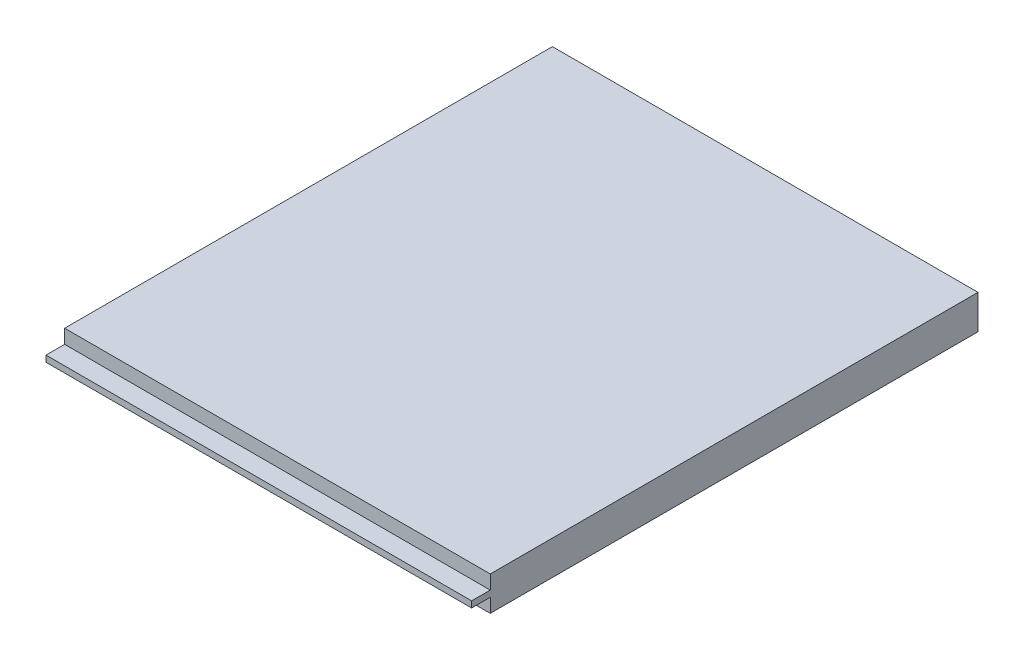
ISO-10303-21;
HEADER;
FILE_DESCRIPTION(('STEP AP214'),'2;1');
FILE_NAME('part.step','',(''),(''),'','','');
FILE_SCHEMA(('AUTOMOTIVE_DESIGN { 1 0 10303 214 1 1 1 1 }'));
ENDSEC;
DATA;
#1=APPLICATION_CONTEXT('core data for automotive mechanical design processes');
#2=APPLICATION_PROTOCOL_DEFINITION('international standard','automotive_design',2000,#1);
#3=PRODUCT_CONTEXT('',#1,'mechanical');
#4=PRODUCT('Part','Part','',(#3));
#5=PRODUCT_RELATED_PRODUCT_CATEGORY('part','',(#4));
#6=PRODUCT_DEFINITION_FORMATION('','',#4);
#7=PRODUCT_DEFINITION_CONTEXT('part definition',#1,'design');
#8=PRODUCT_DEFINITION('design','',#6,#7);
#9=PRODUCT_DEFINITION_SHAPE('','',#8);
#10=(LENGTH_UNIT() NAMED_UNIT(*) SI_UNIT(.MILLI.,.METRE.));
#11=(NAMED_UNIT(*) PLANE_ANGLE_UNIT() SI_UNIT($,.RADIAN.));
#12=(NAMED_UNIT(*) SI_UNIT($,.STERADIAN.) SOLID_ANGLE_UNIT());
#13=UNCERTAINTY_MEASURE_WITH_UNIT(LENGTH_MEASURE(1.E-05),#10,'distance_accuracy_value','');
#14=(GEOMETRIC_REPRESENTATION_CONTEXT(3) GLOBAL_UNCERTAINTY_ASSIGNED_CONTEXT((#13)) GLOBAL_UNIT_ASSIGNED_CONTEXT((#10,
#11,#12)) REPRESENTATION_CONTEXT('',''));
#15=CARTESIAN_POINT('',(0.,0.,0.));
#16=DIRECTION('',(0.,0.,1.));
#17=DIRECTION('',(1.,0.,0.));
#18=AXIS2_PLACEMENT_3D('',#15,#16,#17);
#19=CARTESIAN_POINT('',(-34.25,2.74999999999997,40.75));
#20=DIRECTION('',(1.,0.,0.));
#21=DIRECTION('',(0.,0.,-1.));
#22=AXIS2_PLACEMENT_3D('',#19,#20,#21);
#23=PLANE('',#22);
#24=DIRECTION('',(0.,-1.,0.));
#25=VECTOR('',#24,1.);
#26=CARTESIAN_POINT('',(-34.25,-0.5,37.75));
#27=LINE('',#26,#25);
#28=CARTESIAN_POINT('',(-34.25,-0.5,37.75));
#29=VERTEX_POINT('',#28);
#30=CARTESIAN_POINT('',(-34.25,-2.75000000000002,37.75));
#31=VERTEX_POINT('',#30);
#32=EDGE_CURVE('E101',#29,#31,#27,.T.);
#33=ORIENTED_EDGE('',*,*,#32,.F.);
#34=DIRECTION('',(0.,0.,1.));
#35=VECTOR('',#34,1.);
#36=CARTESIAN_POINT('',(-34.25,-0.5,37.75));
#37=LINE('',#36,#35);
#38=CARTESIAN_POINT('',(-34.25,-0.5,40.75));
#39=VERTEX_POINT('',#38);
#40=EDGE_CURVE('E98',#29,#39,#37,.T.);
#41=ORIENTED_EDGE('',*,*,#40,.T.);
#42=DIRECTION('',(0.,-1.,0.));
#43=VECTOR('',#42,1.);
#44=CARTESIAN_POINT('',(-34.25,2.74999999999997,40.75));
#45=LINE('',#44,#43);
#46=CARTESIAN_POINT('',(-34.25,0.5,40.75));
#47=VERTEX_POINT('',#46);
#48=EDGE_CURVE('E138',#47,#39,#45,.T.);
#49=ORIENTED_EDGE('',*,*,#48,.F.);
#50=DIRECTION('',(0.,0.,1.));
#51=VECTOR('',#50,1.);
#52=CARTESIAN_POINT('',(-34.25,0.5,37.75));
#53=LINE('',#52,#51);
#54=CARTESIAN_POINT('',(-34.25,0.5,37.75));
#55=VERTEX_POINT('',#54);
#56=EDGE_CURVE('E55',#55,#47,#53,.T.);
#57=ORIENTED_EDGE('',*,*,#56,.F.);
#58=DIRECTION('',(0.,-1.,0.));
#59=VECTOR('',#58,1.);
#60=CARTESIAN_POINT('',(-34.25,2.74999999999997,37.75));
#61=LINE('',#60,#59);
#62=CARTESIAN_POINT('',(-34.25,2.74999999999997,37.75));
#63=VERTEX_POINT('',#62);
#64=EDGE_CURVE('E131',#63,#55,#61,.T.);
#65=ORIENTED_EDGE('',*,*,#64,.F.);
#66=DIRECTION('',(0.,0.,-1.));
#67=VECTOR('',#66,1.);
#68=CARTESIAN_POINT('',(-34.25,2.74999999999997,40.75));
#69=LINE('',#68,#67);
#70=CARTESIAN_POINT('',(-34.25,2.74999999999997,-40.75));
#71=VERTEX_POINT('',#70);
#72=EDGE_CURVE('E143',#63,#71,#69,.T.);
#73=ORIENTED_EDGE('',*,*,#72,.T.);
#74=DIRECTION('',(0.,-1.,0.));
#75=VECTOR('',#74,1.);
#76=CARTESIAN_POINT('',(-34.25,2.74999999999997,-40.75));
#77=LINE('',#76,#75);
#78=CARTESIAN_POINT('',(-34.25,-2.75000000000002,-40.75));
#79=VERTEX_POINT('',#78);
#80=EDGE_CURVE('E118',#71,#79,#77,.T.);
#81=ORIENTED_EDGE('',*,*,#80,.T.);
#82=DIRECTION('',(0.,0.,-1.));
#83=VECTOR('',#82,1.);
#84=CARTESIAN_POINT('',(-34.25,-2.75000000000002,40.75));
#85=LINE('',#84,#83);
#86=EDGE_CURVE('E11',#31,#79,#85,.T.);
#87=ORIENTED_EDGE('',*,*,#86,.F.);
#88=EDGE_LOOP('',(#33,#41,#49,#57,#65,#73,#81,#87));
#89=FACE_BOUND('',#88,.T.);
#90=ADVANCED_FACE('F33',(#89),#23,.F.);
#91=CARTESIAN_POINT('',(-34.25,-2.75000000000002,40.75));
#92=DIRECTION('',(0.,1.,0.));
#93=DIRECTION('',(-1.,0.,0.));
#94=AXIS2_PLACEMENT_3D('',#91,#92,#93);
#95=PLANE('',#94);
#96=DIRECTION('',(0.,0.,-1.));
#97=VECTOR('',#96,1.);
#98=CARTESIAN_POINT('',(34.25,-2.75,40.75));
#99=LINE('',#98,#97);
#100=CARTESIAN_POINT('',(34.25,-2.75000000000002,37.75));
#101=VERTEX_POINT('',#100);
#102=CARTESIAN_POINT('',(34.25,-2.75,-40.75));
#103=VERTEX_POINT('',#102);
#104=EDGE_CURVE('E40',#101,#103,#99,.T.);
#105=ORIENTED_EDGE('',*,*,#104,.F.);
#106=DIRECTION('',(1.,0.,0.));
#107=VECTOR('',#106,1.);
#108=CARTESIAN_POINT('',(34.25,-2.75000000000002,37.75));
#109=LINE('',#108,#107);
#110=EDGE_CURVE('E107',#31,#101,#109,.T.);
#111=ORIENTED_EDGE('',*,*,#110,.F.);
#112=ORIENTED_EDGE('',*,*,#86,.T.);
#113=DIRECTION('',(1.,0.,0.));
#114=VECTOR('',#113,1.);
#115=CARTESIAN_POINT('',(-34.25,-2.75000000000002,-40.75));
#116=LINE('',#115,#114);
#117=EDGE_CURVE('E146',#79,#103,#116,.T.);
#118=ORIENTED_EDGE('',*,*,#117,.T.);
#119=EDGE_LOOP('',(#105,#111,#112,#118));
#120=FACE_BOUND('',#119,.T.);
#121=ADVANCED_FACE('F161',(#120),#95,.F.);
#122=CARTESIAN_POINT('',(34.25,2.74999999999999,40.75));
#123=DIRECTION('',(-1.,0.,0.));
#124=DIRECTION('',(0.,0.,1.));
#125=AXIS2_PLACEMENT_3D('',#122,#123,#124);
#126=PLANE('',#125);
#127=DIRECTION('',(0.,1.,0.));
#128=VECTOR('',#127,1.);
#129=CARTESIAN_POINT('',(34.25,2.74999999999999,40.75));
#130=LINE('',#129,#128);
#131=CARTESIAN_POINT('',(34.25,-0.5,40.75));
#132=VERTEX_POINT('',#131);
#133=CARTESIAN_POINT('',(34.25,0.5,40.75));
#134=VERTEX_POINT('',#133);
#135=EDGE_CURVE('E116',#132,#134,#130,.T.);
#136=ORIENTED_EDGE('',*,*,#135,.F.);
#137=DIRECTION('',(0.,0.,1.));
#138=VECTOR('',#137,1.);
#139=CARTESIAN_POINT('',(34.25,-0.5,37.75));
#140=LINE('',#139,#138);
#141=CARTESIAN_POINT('',(34.25,-0.5,37.75));
#142=VERTEX_POINT('',#141);
#143=EDGE_CURVE('E47',#142,#132,#140,.T.);
#144=ORIENTED_EDGE('',*,*,#143,.F.);
#145=DIRECTION('',(0.,1.,0.));
#146=VECTOR('',#145,1.);
#147=CARTESIAN_POINT('',(34.25,-0.5,37.75));
#148=LINE('',#147,#146);
#149=EDGE_CURVE('E102',#101,#142,#148,.T.);
#150=ORIENTED_EDGE('',*,*,#149,.F.);
#151=ORIENTED_EDGE('',*,*,#104,.T.);
#152=DIRECTION('',(0.,1.,0.));
#153=VECTOR('',#152,1.);
#154=CARTESIAN_POINT('',(34.25,2.74999999999999,-40.75));
#155=LINE('',#154,#153);
#156=CARTESIAN_POINT('',(34.25,2.74999999999999,-40.75));
#157=VERTEX_POINT('',#156);
#158=EDGE_CURVE('E149',#103,#157,#155,.T.);
#159=ORIENTED_EDGE('',*,*,#158,.T.);
#160=DIRECTION('',(0.,0.,-1.));
#161=VECTOR('',#160,1.);
#162=CARTESIAN_POINT('',(34.25,2.74999999999999,40.75));
#163=LINE('',#162,#161);
#164=CARTESIAN_POINT('',(34.25,2.74999999999997,37.75));
#165=VERTEX_POINT('',#164);
#166=EDGE_CURVE('E155',#165,#157,#163,.T.);
#167=ORIENTED_EDGE('',*,*,#166,.F.);
#168=DIRECTION('',(0.,1.,0.));
#169=VECTOR('',#168,1.);
#170=CARTESIAN_POINT('',(34.25,2.74999999999997,37.75));
#171=LINE('',#170,#169);
#172=CARTESIAN_POINT('',(34.25,0.5,37.75));
#173=VERTEX_POINT('',#172);
#174=EDGE_CURVE('E126',#173,#165,#171,.T.);
#175=ORIENTED_EDGE('',*,*,#174,.F.);
#176=DIRECTION('',(0.,0.,1.));
#177=VECTOR('',#176,1.);
#178=CARTESIAN_POINT('',(34.25,0.5,37.75));
#179=LINE('',#178,#177);
#180=EDGE_CURVE('E134',#173,#134,#179,.T.);
#181=ORIENTED_EDGE('',*,*,#180,.T.);
#182=EDGE_LOOP('',(#136,#144,#150,#151,#159,#167,#175,#181));
#183=FACE_BOUND('',#182,.T.);
#184=ADVANCED_FACE('F113',(#183),#126,.F.);
#185=CARTESIAN_POINT('',(-34.25,2.74999999999997,40.75));
#186=DIRECTION('',(0.,-1.,0.));
#187=DIRECTION('',(1.,0.,0.));
#188=AXIS2_PLACEMENT_3D('',#185,#186,#187);
#189=PLANE('',#188);
#190=ORIENTED_EDGE('',*,*,#72,.F.);
#191=DIRECTION('',(-1.,0.,0.));
#192=VECTOR('',#191,1.);
#193=CARTESIAN_POINT('',(-34.25,2.74999999999997,37.75));
#194=LINE('',#193,#192);
#195=EDGE_CURVE('E129',#165,#63,#194,.T.);
#196=ORIENTED_EDGE('',*,*,#195,.F.);
#197=ORIENTED_EDGE('',*,*,#166,.T.);
#198=DIRECTION('',(-1.,0.,0.));
#199=VECTOR('',#198,1.);
#200=CARTESIAN_POINT('',(-34.25,2.74999999999997,-40.75));
#201=LINE('',#200,#199);
#202=EDGE_CURVE('E141',#157,#71,#201,.T.);
#203=ORIENTED_EDGE('',*,*,#202,.T.);
#204=EDGE_LOOP('',(#190,#196,#197,#203));
#205=FACE_BOUND('',#204,.T.);
#206=ADVANCED_FACE('F168',(#205),#189,.F.);
#207=CARTESIAN_POINT('',(0.,0.,40.75));
#208=DIRECTION('',(0.,0.,1.));
#209=DIRECTION('',(1.,0.,0.));
#210=AXIS2_PLACEMENT_3D('',#207,#208,#209);
#211=PLANE('',#210);
#212=DIRECTION('',(-1.,0.,0.));
#213=VECTOR('',#212,1.);
#214=CARTESIAN_POINT('',(34.25,-0.5,40.75));
#215=LINE('',#214,#213);
#216=EDGE_CURVE('E110',#132,#39,#215,.T.);
#217=ORIENTED_EDGE('',*,*,#216,.F.);
#218=ORIENTED_EDGE('',*,*,#135,.T.);
#219=DIRECTION('',(1.,0.,0.));
#220=VECTOR('',#219,1.);
#221=CARTESIAN_POINT('',(-34.25,0.5,40.75));
#222=LINE('',#221,#220);
#223=EDGE_CURVE('E127',#47,#134,#222,.T.);
#224=ORIENTED_EDGE('',*,*,#223,.F.);
#225=ORIENTED_EDGE('',*,*,#48,.T.);
#226=EDGE_LOOP('',(#217,#218,#224,#225));
#227=FACE_BOUND('',#226,.T.);
#228=ADVANCED_FACE('F177',(#227),#211,.T.);
#229=CARTESIAN_POINT('',(0.,0.,-40.75));
#230=DIRECTION('',(0.,0.,1.));
#231=DIRECTION('',(1.,0.,0.));
#232=AXIS2_PLACEMENT_3D('',#229,#230,#231);
#233=PLANE('',#232);
#234=ORIENTED_EDGE('',*,*,#80,.F.);
#235=ORIENTED_EDGE('',*,*,#202,.F.);
#236=ORIENTED_EDGE('',*,*,#158,.F.);
#237=ORIENTED_EDGE('',*,*,#117,.F.);
#238=EDGE_LOOP('',(#234,#235,#236,#237));
#239=FACE_BOUND('',#238,.T.);
#240=ADVANCED_FACE('F165',(#239),#233,.F.);
#241=CARTESIAN_POINT('',(-34.25,0.5,37.75));
#242=DIRECTION('',(0.,-1.,0.));
#243=DIRECTION('',(0.,0.,-1.));
#244=AXIS2_PLACEMENT_3D('',#241,#242,#243);
#245=PLANE('',#244);
#246=ORIENTED_EDGE('',*,*,#223,.T.);
#247=ORIENTED_EDGE('',*,*,#180,.F.);
#248=DIRECTION('',(1.,0.,0.));
#249=VECTOR('',#248,1.);
#250=CARTESIAN_POINT('',(-34.25,0.5,37.75));
#251=LINE('',#250,#249);
#252=EDGE_CURVE('E123',#55,#173,#251,.T.);
#253=ORIENTED_EDGE('',*,*,#252,.F.);
#254=ORIENTED_EDGE('',*,*,#56,.T.);
#255=EDGE_LOOP('',(#246,#247,#253,#254));
#256=FACE_BOUND('',#255,.T.);
#257=ADVANCED_FACE('F174',(#256),#245,.F.);
#258=CARTESIAN_POINT('',(0.,0.,37.75));
#259=DIRECTION('',(0.,0.,-1.));
#260=DIRECTION('',(-1.,0.,0.));
#261=AXIS2_PLACEMENT_3D('',#258,#259,#260);
#262=PLANE('',#261);
#263=ORIENTED_EDGE('',*,*,#252,.T.);
#264=ORIENTED_EDGE('',*,*,#174,.T.);
#265=ORIENTED_EDGE('',*,*,#195,.T.);
#266=ORIENTED_EDGE('',*,*,#64,.T.);
#267=EDGE_LOOP('',(#263,#264,#265,#266));
#268=FACE_BOUND('',#267,.T.);
#269=ADVANCED_FACE('F172',(#268),#262,.F.);
#270=CARTESIAN_POINT('',(34.25,-0.5,37.75));
#271=DIRECTION('',(0.,1.,0.));
#272=DIRECTION('',(0.,0.,1.));
#273=AXIS2_PLACEMENT_3D('',#270,#271,#272);
#274=PLANE('',#273);
#275=ORIENTED_EDGE('',*,*,#216,.T.);
#276=ORIENTED_EDGE('',*,*,#40,.F.);
#277=DIRECTION('',(-1.,0.,0.));
#278=VECTOR('',#277,1.);
#279=CARTESIAN_POINT('',(34.25,-0.5,37.75));
#280=LINE('',#279,#278);
#281=EDGE_CURVE('E94',#142,#29,#280,.T.);
#282=ORIENTED_EDGE('',*,*,#281,.F.);
#283=ORIENTED_EDGE('',*,*,#143,.T.);
#284=EDGE_LOOP('',(#275,#276,#282,#283));
#285=FACE_BOUND('',#284,.T.);
#286=ADVANCED_FACE('F96',(#285),#274,.F.);
#287=CARTESIAN_POINT('',(0.,0.,37.75));
#288=DIRECTION('',(0.,0.,-1.));
#289=DIRECTION('',(-1.,0.,0.));
#290=AXIS2_PLACEMENT_3D('',#287,#288,#289);
#291=PLANE('',#290);
#292=ORIENTED_EDGE('',*,*,#149,.T.);
#293=ORIENTED_EDGE('',*,*,#281,.T.);
#294=ORIENTED_EDGE('',*,*,#32,.T.);
#295=ORIENTED_EDGE('',*,*,#110,.T.);
#296=EDGE_LOOP('',(#292,#293,#294,#295));
#297=FACE_BOUND('',#296,.T.);
#298=ADVANCED_FACE('F105',(#297),#291,.F.);
#299=CLOSED_SHELL('',(#90,#121,#184,#206,#228,#240,#257,#269,#286,#298));
#300=MANIFOLD_SOLID_BREP('B2',#299);
#301=ADVANCED_BREP_SHAPE_REPRESENTATION('',(#18,#300),#14);
#302=SHAPE_DEFINITION_REPRESENTATION(#9,#301);
ENDSEC;
END-ISO-10303-21;
